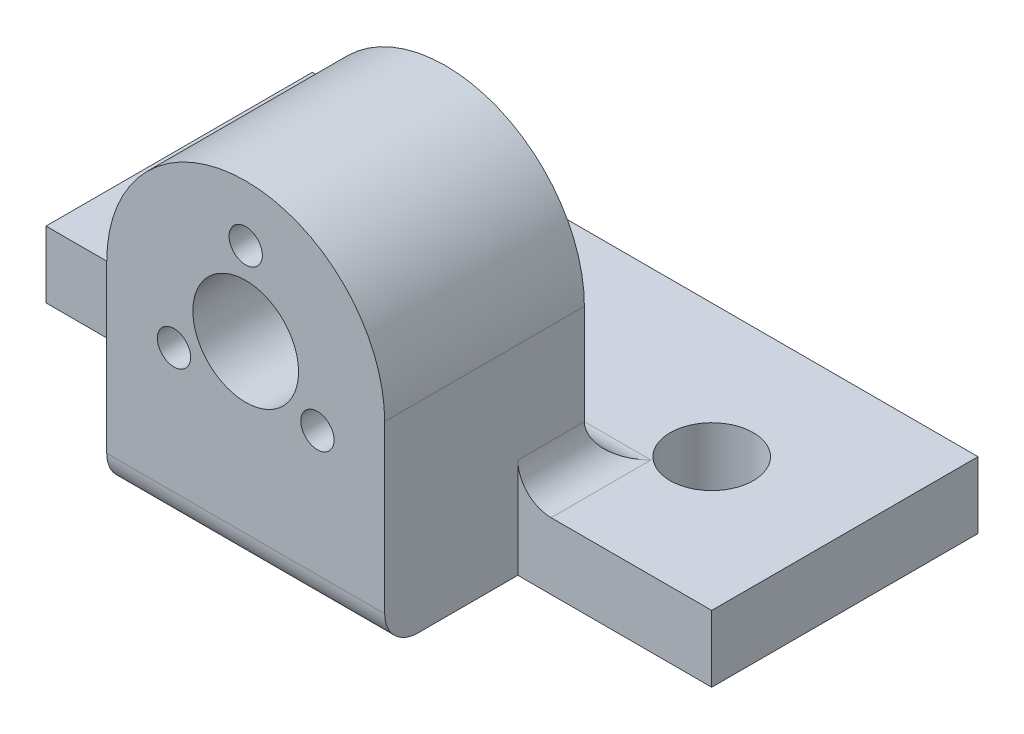
ISO-10303-21;
HEADER;
FILE_DESCRIPTION(('STEP AP214'),'2;1');
FILE_NAME('part.step','',(''),(''),'','','');
FILE_SCHEMA(('AUTOMOTIVE_DESIGN { 1 0 10303 214 1 1 1 1 }'));
ENDSEC;
DATA;
#1=APPLICATION_CONTEXT('core data for automotive mechanical design processes');
#2=APPLICATION_PROTOCOL_DEFINITION('international standard','automotive_design',2000,#1);
#3=PRODUCT_CONTEXT('',#1,'mechanical');
#4=PRODUCT('Part','Part','',(#3));
#5=PRODUCT_RELATED_PRODUCT_CATEGORY('part','',(#4));
#6=PRODUCT_DEFINITION_FORMATION('','',#4);
#7=PRODUCT_DEFINITION_CONTEXT('part definition',#1,'design');
#8=PRODUCT_DEFINITION('design','',#6,#7);
#9=PRODUCT_DEFINITION_SHAPE('','',#8);
#10=(LENGTH_UNIT() NAMED_UNIT(*) SI_UNIT(.MILLI.,.METRE.));
#11=(NAMED_UNIT(*) PLANE_ANGLE_UNIT() SI_UNIT($,.RADIAN.));
#12=(NAMED_UNIT(*) SI_UNIT($,.STERADIAN.) SOLID_ANGLE_UNIT());
#13=UNCERTAINTY_MEASURE_WITH_UNIT(LENGTH_MEASURE(1.E-05),#10,'distance_accuracy_value','');
#14=(GEOMETRIC_REPRESENTATION_CONTEXT(3) GLOBAL_UNCERTAINTY_ASSIGNED_CONTEXT((#13)) GLOBAL_UNIT_ASSIGNED_CONTEXT((#10,
#11,#12)) REPRESENTATION_CONTEXT('',''));
#15=CARTESIAN_POINT('',(0.,0.,0.));
#16=DIRECTION('',(0.,0.,1.));
#17=DIRECTION('',(1.,0.,0.));
#18=AXIS2_PLACEMENT_3D('',#15,#16,#17);
#19=CARTESIAN_POINT('',(10.,6.,4.));
#20=DIRECTION('',(0.,0.,-1.));
#21=DIRECTION('',(-1.,0.,0.));
#22=AXIS2_PLACEMENT_3D('',#19,#20,#21);
#23=CYLINDRICAL_SURFACE('',#22,1.);
#24=CARTESIAN_POINT('',(10.,6.,-2.));
#25=DIRECTION('',(0.,0.,1.));
#26=DIRECTION('',(1.,0.,0.));
#27=AXIS2_PLACEMENT_3D('',#24,#25,#26);
#28=CIRCLE('',#27,1.);
#29=CARTESIAN_POINT('',(11.,6.,-2.));
#30=VERTEX_POINT('',#29);
#31=EDGE_CURVE('E273',#30,#30,#28,.T.);
#32=ORIENTED_EDGE('',*,*,#31,.F.);
#33=EDGE_LOOP('',(#32));
#34=FACE_BOUND('',#33,.T.);
#35=CARTESIAN_POINT('',(10.,6.,0.));
#36=DIRECTION('',(0.,0.,1.));
#37=DIRECTION('',(1.,0.,0.));
#38=AXIS2_PLACEMENT_3D('',#35,#36,#37);
#39=CIRCLE('',#38,1.);
#40=CARTESIAN_POINT('',(11.,6.,0.));
#41=VERTEX_POINT('',#40);
#42=EDGE_CURVE('E229',#41,#41,#39,.T.);
#43=ORIENTED_EDGE('',*,*,#42,.T.);
#44=EDGE_LOOP('',(#43));
#45=FACE_BOUND('',#44,.T.);
#46=ADVANCED_FACE('F33',(#34,#45),#23,.F.);
#47=CARTESIAN_POINT('',(0.,2.,0.));
#48=DIRECTION('',(0.,-1.,0.));
#49=DIRECTION('',(0.,0.,-1.));
#50=AXIS2_PLACEMENT_3D('',#47,#48,#49);
#51=PLANE('',#50);
#52=CARTESIAN_POINT('',(16.,2.,-4.));
#53=DIRECTION('',(0.,1.,0.));
#54=DIRECTION('',(0.,0.,1.));
#55=AXIS2_PLACEMENT_3D('',#52,#53,#54);
#56=CIRCLE('',#55,1.25);
#57=CARTESIAN_POINT('',(16.,2.,-2.75));
#58=VERTEX_POINT('',#57);
#59=EDGE_CURVE('E181',#58,#58,#56,.T.);
#60=ORIENTED_EDGE('',*,*,#59,.F.);
#61=EDGE_LOOP('',(#60));
#62=FACE_BOUND('',#61,.T.);
#63=CARTESIAN_POINT('',(4.,2.,-4.));
#64=DIRECTION('',(0.,1.,0.));
#65=DIRECTION('',(0.,0.,1.));
#66=AXIS2_PLACEMENT_3D('',#63,#64,#65);
#67=CIRCLE('',#66,1.25);
#68=CARTESIAN_POINT('',(4.,2.,-2.75));
#69=VERTEX_POINT('',#68);
#70=EDGE_CURVE('E187',#69,#69,#67,.T.);
#71=ORIENTED_EDGE('',*,*,#70,.F.);
#72=EDGE_LOOP('',(#71));
#73=FACE_BOUND('',#72,.T.);
#74=DIRECTION('',(-1.,0.,0.));
#75=VECTOR('',#74,1.);
#76=CARTESIAN_POINT('',(14.175,2.,-3.));
#77=LINE('',#76,#75);
#78=CARTESIAN_POINT('',(4.825,2.,-3.));
#79=VERTEX_POINT('',#78);
#80=CARTESIAN_POINT('',(15.175,2.,-3.));
#81=VERTEX_POINT('',#80);
#82=EDGE_CURVE('E237',#79,#81,#77,.F.);
#83=ORIENTED_EDGE('',*,*,#82,.T.);
#84=DIRECTION('',(0.,0.,-1.));
#85=VECTOR('',#84,1.);
#86=CARTESIAN_POINT('',(15.175,2.,0.));
#87=LINE('',#86,#85);
#88=CARTESIAN_POINT('',(15.175,2.,0.));
#89=VERTEX_POINT('',#88);
#90=EDGE_CURVE('E239',#81,#89,#87,.F.);
#91=ORIENTED_EDGE('',*,*,#90,.T.);
#92=DIRECTION('',(1.,0.,0.));
#93=VECTOR('',#92,1.);
#94=CARTESIAN_POINT('',(0.,2.,0.));
#95=LINE('',#94,#93);
#96=CARTESIAN_POINT('',(20.,2.,0.));
#97=VERTEX_POINT('',#96);
#98=EDGE_CURVE('E196',#89,#97,#95,.T.);
#99=ORIENTED_EDGE('',*,*,#98,.T.);
#100=DIRECTION('',(0.,0.,-1.));
#101=VECTOR('',#100,1.);
#102=CARTESIAN_POINT('',(20.,2.,0.));
#103=LINE('',#102,#101);
#104=CARTESIAN_POINT('',(20.,2.,-8.));
#105=VERTEX_POINT('',#104);
#106=EDGE_CURVE('E201',#97,#105,#103,.T.);
#107=ORIENTED_EDGE('',*,*,#106,.T.);
#108=DIRECTION('',(-1.,0.,0.));
#109=VECTOR('',#108,1.);
#110=CARTESIAN_POINT('',(0.,2.,-8.));
#111=LINE('',#110,#109);
#112=CARTESIAN_POINT('',(0.,2.,-8.));
#113=VERTEX_POINT('',#112);
#114=EDGE_CURVE('E203',#105,#113,#111,.T.);
#115=ORIENTED_EDGE('',*,*,#114,.T.);
#116=DIRECTION('',(0.,0.,1.));
#117=VECTOR('',#116,1.);
#118=CARTESIAN_POINT('',(0.,2.,0.));
#119=LINE('',#118,#117);
#120=CARTESIAN_POINT('',(0.,2.,0.));
#121=VERTEX_POINT('',#120);
#122=EDGE_CURVE('E193',#113,#121,#119,.T.);
#123=ORIENTED_EDGE('',*,*,#122,.T.);
#124=CARTESIAN_POINT('',(4.825,2.,0.));
#125=VERTEX_POINT('',#124);
#126=EDGE_CURVE('E198',#121,#125,#95,.T.);
#127=ORIENTED_EDGE('',*,*,#126,.T.);
#128=DIRECTION('',(0.,0.,1.));
#129=VECTOR('',#128,1.);
#130=CARTESIAN_POINT('',(4.825,2.,-2.));
#131=LINE('',#130,#129);
#132=EDGE_CURVE('E235',#125,#79,#131,.F.);
#133=ORIENTED_EDGE('',*,*,#132,.T.);
#134=EDGE_LOOP('',(#83,#91,#99,#107,#115,#123,#127,#133));
#135=FACE_BOUND('',#134,.T.);
#136=ADVANCED_FACE('F300',(#62,#73,#135),#51,.F.);
#137=CARTESIAN_POINT('',(0.,2.,0.));
#138=DIRECTION('',(0.,0.,-1.));
#139=DIRECTION('',(-1.,0.,0.));
#140=AXIS2_PLACEMENT_3D('',#137,#138,#139);
#141=PLANE('',#140);
#142=DIRECTION('',(0.,1.,0.));
#143=VECTOR('',#142,1.);
#144=CARTESIAN_POINT('',(14.175,2.,0.));
#145=LINE('',#144,#143);
#146=CARTESIAN_POINT('',(14.175,0.,0.));
#147=VERTEX_POINT('',#146);
#148=CARTESIAN_POINT('',(14.175,3.,0.));
#149=VERTEX_POINT('',#148);
#150=EDGE_CURVE('E226',#147,#149,#145,.T.);
#151=ORIENTED_EDGE('',*,*,#150,.F.);
#152=DIRECTION('',(1.,0.,0.));
#153=VECTOR('',#152,1.);
#154=CARTESIAN_POINT('',(0.,0.,0.));
#155=LINE('',#154,#153);
#156=CARTESIAN_POINT('',(20.,0.,0.));
#157=VERTEX_POINT('',#156);
#158=EDGE_CURVE('E208',#147,#157,#155,.T.);
#159=ORIENTED_EDGE('',*,*,#158,.T.);
#160=DIRECTION('',(0.,-1.,0.));
#161=VECTOR('',#160,1.);
#162=CARTESIAN_POINT('',(20.,2.,0.));
#163=LINE('',#162,#161);
#164=EDGE_CURVE('E219',#97,#157,#163,.T.);
#165=ORIENTED_EDGE('',*,*,#164,.F.);
#166=ORIENTED_EDGE('',*,*,#98,.F.);
#167=CARTESIAN_POINT('',(15.175,3.,0.));
#168=DIRECTION('',(0.,0.,-1.));
#169=DIRECTION('',(-1.,0.,0.));
#170=AXIS2_PLACEMENT_3D('',#167,#168,#169);
#171=CIRCLE('',#170,1.);
#172=EDGE_CURVE('E42',#89,#149,#171,.T.);
#173=ORIENTED_EDGE('',*,*,#172,.T.);
#174=EDGE_LOOP('',(#151,#159,#165,#166,#173));
#175=FACE_BOUND('',#174,.T.);
#176=ADVANCED_FACE('F308',(#175),#141,.F.);
#177=DIRECTION('',(0.,-1.,0.));
#178=VECTOR('',#177,1.);
#179=CARTESIAN_POINT('',(5.825,2.,0.));
#180=LINE('',#179,#178);
#181=CARTESIAN_POINT('',(5.825,3.,0.));
#182=VERTEX_POINT('',#181);
#183=CARTESIAN_POINT('',(5.825,0.,0.));
#184=VERTEX_POINT('',#183);
#185=EDGE_CURVE('E49',#182,#184,#180,.T.);
#186=ORIENTED_EDGE('',*,*,#185,.F.);
#187=CARTESIAN_POINT('',(4.825,3.,0.));
#188=DIRECTION('',(0.,0.,-1.));
#189=DIRECTION('',(-1.,0.,0.));
#190=AXIS2_PLACEMENT_3D('',#187,#188,#189);
#191=CIRCLE('',#190,1.);
#192=EDGE_CURVE('E11',#182,#125,#191,.T.);
#193=ORIENTED_EDGE('',*,*,#192,.T.);
#194=ORIENTED_EDGE('',*,*,#126,.F.);
#195=DIRECTION('',(0.,-1.,0.));
#196=VECTOR('',#195,1.);
#197=CARTESIAN_POINT('',(0.,2.,0.));
#198=LINE('',#197,#196);
#199=CARTESIAN_POINT('',(0.,0.,0.));
#200=VERTEX_POINT('',#199);
#201=EDGE_CURVE('E222',#121,#200,#198,.T.);
#202=ORIENTED_EDGE('',*,*,#201,.T.);
#203=EDGE_CURVE('E209',#200,#184,#155,.T.);
#204=ORIENTED_EDGE('',*,*,#203,.T.);
#205=EDGE_LOOP('',(#186,#193,#194,#202,#204));
#206=FACE_BOUND('',#205,.T.);
#207=ADVANCED_FACE('F342',(#206),#141,.F.);
#208=CARTESIAN_POINT('',(0.,0.,0.));
#209=DIRECTION('',(0.,-1.,0.));
#210=DIRECTION('',(0.,0.,-1.));
#211=AXIS2_PLACEMENT_3D('',#208,#209,#210);
#212=PLANE('',#211);
#213=DIRECTION('',(0.,0.,-1.));
#214=VECTOR('',#213,1.);
#215=CARTESIAN_POINT('',(14.175,0.,4.));
#216=LINE('',#215,#214);
#217=CARTESIAN_POINT('',(14.175,0.,3.));
#218=VERTEX_POINT('',#217);
#219=EDGE_CURVE('E152',#218,#147,#216,.T.);
#220=ORIENTED_EDGE('',*,*,#219,.F.);
#221=DIRECTION('',(1.,0.,0.));
#222=VECTOR('',#221,1.);
#223=CARTESIAN_POINT('',(0.,0.,3.));
#224=LINE('',#223,#222);
#225=CARTESIAN_POINT('',(5.825,0.,3.));
#226=VERTEX_POINT('',#225);
#227=EDGE_CURVE('E57',#218,#226,#224,.F.);
#228=ORIENTED_EDGE('',*,*,#227,.T.);
#229=DIRECTION('',(0.,0.,-1.));
#230=VECTOR('',#229,1.);
#231=CARTESIAN_POINT('',(5.825,0.,4.));
#232=LINE('',#231,#230);
#233=EDGE_CURVE('E178',#226,#184,#232,.T.);
#234=ORIENTED_EDGE('',*,*,#233,.T.);
#235=ORIENTED_EDGE('',*,*,#203,.F.);
#236=DIRECTION('',(0.,0.,1.));
#237=VECTOR('',#236,1.);
#238=CARTESIAN_POINT('',(0.,0.,0.));
#239=LINE('',#238,#237);
#240=CARTESIAN_POINT('',(0.,0.,-8.));
#241=VERTEX_POINT('',#240);
#242=EDGE_CURVE('E190',#241,#200,#239,.T.);
#243=ORIENTED_EDGE('',*,*,#242,.F.);
#244=DIRECTION('',(-1.,0.,0.));
#245=VECTOR('',#244,1.);
#246=CARTESIAN_POINT('',(0.,0.,-8.));
#247=LINE('',#246,#245);
#248=CARTESIAN_POINT('',(20.,0.,-8.));
#249=VERTEX_POINT('',#248);
#250=EDGE_CURVE('E197',#249,#241,#247,.T.);
#251=ORIENTED_EDGE('',*,*,#250,.F.);
#252=DIRECTION('',(0.,0.,-1.));
#253=VECTOR('',#252,1.);
#254=CARTESIAN_POINT('',(20.,0.,0.));
#255=LINE('',#254,#253);
#256=EDGE_CURVE('E211',#157,#249,#255,.T.);
#257=ORIENTED_EDGE('',*,*,#256,.F.);
#258=ORIENTED_EDGE('',*,*,#158,.F.);
#259=EDGE_LOOP('',(#220,#228,#234,#235,#243,#251,#257,#258));
#260=FACE_BOUND('',#259,.T.);
#261=CARTESIAN_POINT('',(16.,0.,-4.));
#262=DIRECTION('',(0.,1.,0.));
#263=DIRECTION('',(0.,0.,1.));
#264=AXIS2_PLACEMENT_3D('',#261,#262,#263);
#265=CIRCLE('',#264,1.25);
#266=CARTESIAN_POINT('',(16.,0.,-2.75));
#267=VERTEX_POINT('',#266);
#268=EDGE_CURVE('E180',#267,#267,#265,.T.);
#269=ORIENTED_EDGE('',*,*,#268,.T.);
#270=EDGE_LOOP('',(#269));
#271=FACE_BOUND('',#270,.T.);
#272=CARTESIAN_POINT('',(4.,0.,-4.));
#273=DIRECTION('',(0.,1.,0.));
#274=DIRECTION('',(0.,0.,1.));
#275=AXIS2_PLACEMENT_3D('',#272,#273,#274);
#276=CIRCLE('',#275,1.25);
#277=CARTESIAN_POINT('',(4.,0.,-2.75));
#278=VERTEX_POINT('',#277);
#279=EDGE_CURVE('E184',#278,#278,#276,.T.);
#280=ORIENTED_EDGE('',*,*,#279,.T.);
#281=EDGE_LOOP('',(#280));
#282=FACE_BOUND('',#281,.T.);
#283=ADVANCED_FACE('F289',(#260,#271,#282),#212,.T.);
#284=CARTESIAN_POINT('',(0.,2.,0.));
#285=DIRECTION('',(1.,0.,0.));
#286=DIRECTION('',(0.,0.,-1.));
#287=AXIS2_PLACEMENT_3D('',#284,#285,#286);
#288=PLANE('',#287);
#289=ORIENTED_EDGE('',*,*,#242,.T.);
#290=ORIENTED_EDGE('',*,*,#201,.F.);
#291=ORIENTED_EDGE('',*,*,#122,.F.);
#292=DIRECTION('',(0.,-1.,0.));
#293=VECTOR('',#292,1.);
#294=CARTESIAN_POINT('',(0.,2.,-8.));
#295=LINE('',#294,#293);
#296=EDGE_CURVE('E205',#113,#241,#295,.T.);
#297=ORIENTED_EDGE('',*,*,#296,.T.);
#298=EDGE_LOOP('',(#289,#290,#291,#297));
#299=FACE_BOUND('',#298,.T.);
#300=ADVANCED_FACE('F341',(#299),#288,.F.);
#301=CARTESIAN_POINT('',(20.,2.,0.));
#302=DIRECTION('',(-1.,0.,0.));
#303=DIRECTION('',(0.,0.,1.));
#304=AXIS2_PLACEMENT_3D('',#301,#302,#303);
#305=PLANE('',#304);
#306=ORIENTED_EDGE('',*,*,#256,.T.);
#307=DIRECTION('',(0.,-1.,0.));
#308=VECTOR('',#307,1.);
#309=CARTESIAN_POINT('',(20.,2.,-8.));
#310=LINE('',#309,#308);
#311=EDGE_CURVE('E216',#105,#249,#310,.T.);
#312=ORIENTED_EDGE('',*,*,#311,.F.);
#313=ORIENTED_EDGE('',*,*,#106,.F.);
#314=ORIENTED_EDGE('',*,*,#164,.T.);
#315=EDGE_LOOP('',(#306,#312,#313,#314));
#316=FACE_BOUND('',#315,.T.);
#317=ADVANCED_FACE('F345',(#316),#305,.F.);
#318=CARTESIAN_POINT('',(0.,2.,-8.));
#319=DIRECTION('',(0.,0.,1.));
#320=DIRECTION('',(1.,0.,0.));
#321=AXIS2_PLACEMENT_3D('',#318,#319,#320);
#322=PLANE('',#321);
#323=ORIENTED_EDGE('',*,*,#250,.T.);
#324=ORIENTED_EDGE('',*,*,#296,.F.);
#325=ORIENTED_EDGE('',*,*,#114,.F.);
#326=ORIENTED_EDGE('',*,*,#311,.T.);
#327=EDGE_LOOP('',(#323,#324,#325,#326));
#328=FACE_BOUND('',#327,.T.);
#329=ADVANCED_FACE('F336',(#328),#322,.F.);
#330=CARTESIAN_POINT('',(4.,2.,-4.));
#331=DIRECTION('',(0.,-1.,0.));
#332=DIRECTION('',(0.,0.,-1.));
#333=AXIS2_PLACEMENT_3D('',#330,#331,#332);
#334=CYLINDRICAL_SURFACE('',#333,1.25);
#335=ORIENTED_EDGE('',*,*,#70,.T.);
#336=EDGE_LOOP('',(#335));
#337=FACE_BOUND('',#336,.T.);
#338=ORIENTED_EDGE('',*,*,#279,.F.);
#339=EDGE_LOOP('',(#338));
#340=FACE_BOUND('',#339,.T.);
#341=ADVANCED_FACE('F333',(#337,#340),#334,.F.);
#342=CARTESIAN_POINT('',(16.,2.,-4.));
#343=DIRECTION('',(0.,-1.,0.));
#344=DIRECTION('',(0.,0.,-1.));
#345=AXIS2_PLACEMENT_3D('',#342,#343,#344);
#346=CYLINDRICAL_SURFACE('',#345,1.25);
#347=ORIENTED_EDGE('',*,*,#59,.T.);
#348=EDGE_LOOP('',(#347));
#349=FACE_BOUND('',#348,.T.);
#350=ORIENTED_EDGE('',*,*,#268,.F.);
#351=EDGE_LOOP('',(#350));
#352=FACE_BOUND('',#351,.T.);
#353=ADVANCED_FACE('F330',(#349,#352),#346,.F.);
#354=CARTESIAN_POINT('',(10.,6.,-2.));
#355=DIRECTION('',(0.,0.,1.));
#356=DIRECTION('',(1.,0.,0.));
#357=AXIS2_PLACEMENT_3D('',#354,#355,#356);
#358=PLANE('',#357);
#359=CARTESIAN_POINT('',(10.,8.4875,-2.));
#360=DIRECTION('',(0.,0.,1.));
#361=DIRECTION('',(1.,0.,0.));
#362=AXIS2_PLACEMENT_3D('',#359,#360,#361);
#363=CIRCLE('',#362,0.500000000000001);
#364=CARTESIAN_POINT('',(10.5,8.4875,-2.));
#365=VERTEX_POINT('',#364);
#366=EDGE_CURVE('E276',#365,#365,#363,.T.);
#367=ORIENTED_EDGE('',*,*,#366,.T.);
#368=EDGE_LOOP('',(#367));
#369=FACE_BOUND('',#368,.T.);
#370=ORIENTED_EDGE('',*,*,#31,.T.);
#371=EDGE_LOOP('',(#370));
#372=FACE_BOUND('',#371,.T.);
#373=CARTESIAN_POINT('',(12.1542381919138,4.75625,-2.));
#374=DIRECTION('',(0.,0.,1.));
#375=DIRECTION('',(1.,0.,0.));
#376=AXIS2_PLACEMENT_3D('',#373,#374,#375);
#377=CIRCLE('',#376,0.500000000000001);
#378=CARTESIAN_POINT('',(12.6542381919138,4.75625,-2.));
#379=VERTEX_POINT('',#378);
#380=EDGE_CURVE('E270',#379,#379,#377,.T.);
#381=ORIENTED_EDGE('',*,*,#380,.T.);
#382=EDGE_LOOP('',(#381));
#383=FACE_BOUND('',#382,.T.);
#384=CARTESIAN_POINT('',(7.84576180808621,4.75625,-2.));
#385=DIRECTION('',(0.,0.,1.));
#386=DIRECTION('',(1.,0.,0.));
#387=AXIS2_PLACEMENT_3D('',#384,#385,#386);
#388=CIRCLE('',#387,0.500000000000003);
#389=CARTESIAN_POINT('',(8.34576180808621,4.75625,-2.));
#390=VERTEX_POINT('',#389);
#391=EDGE_CURVE('E232',#390,#390,#388,.T.);
#392=ORIENTED_EDGE('',*,*,#391,.T.);
#393=EDGE_LOOP('',(#392));
#394=FACE_BOUND('',#393,.T.);
#395=DIRECTION('',(0.,1.,0.));
#396=VECTOR('',#395,1.);
#397=CARTESIAN_POINT('',(14.175,2.,-2.));
#398=LINE('',#397,#396);
#399=CARTESIAN_POINT('',(14.175,3.,-2.));
#400=VERTEX_POINT('',#399);
#401=CARTESIAN_POINT('',(14.175,6.,-2.));
#402=VERTEX_POINT('',#401);
#403=EDGE_CURVE('E131',#400,#402,#398,.T.);
#404=ORIENTED_EDGE('',*,*,#403,.F.);
#405=DIRECTION('',(-1.,0.,0.));
#406=VECTOR('',#405,1.);
#407=CARTESIAN_POINT('',(5.825,3.,-2.));
#408=LINE('',#407,#406);
#409=CARTESIAN_POINT('',(5.825,3.,-2.));
#410=VERTEX_POINT('',#409);
#411=EDGE_CURVE('E228',#400,#410,#408,.T.);
#412=ORIENTED_EDGE('',*,*,#411,.T.);
#413=DIRECTION('',(0.,-1.,0.));
#414=VECTOR('',#413,1.);
#415=CARTESIAN_POINT('',(5.825,2.,-2.));
#416=LINE('',#415,#414);
#417=CARTESIAN_POINT('',(5.825,6.,-2.));
#418=VERTEX_POINT('',#417);
#419=EDGE_CURVE('E144',#418,#410,#416,.T.);
#420=ORIENTED_EDGE('',*,*,#419,.F.);
#421=CARTESIAN_POINT('',(10.,6.,-2.));
#422=DIRECTION('',(0.,0.,1.));
#423=DIRECTION('',(1.,0.,0.));
#424=AXIS2_PLACEMENT_3D('',#421,#422,#423);
#425=CIRCLE('',#424,4.175);
#426=EDGE_CURVE('E143',#402,#418,#425,.T.);
#427=ORIENTED_EDGE('',*,*,#426,.F.);
#428=EDGE_LOOP('',(#404,#412,#420,#427));
#429=FACE_BOUND('',#428,.T.);
#430=ADVANCED_FACE('F156',(#369,#372,#383,#394,#429),#358,.F.);
#431=CARTESIAN_POINT('',(14.175,2.,4.));
#432=DIRECTION('',(-1.,0.,0.));
#433=DIRECTION('',(0.,0.,1.));
#434=AXIS2_PLACEMENT_3D('',#431,#432,#433);
#435=PLANE('',#434);
#436=ORIENTED_EDGE('',*,*,#150,.T.);
#437=DIRECTION('',(0.,0.,-1.));
#438=VECTOR('',#437,1.);
#439=CARTESIAN_POINT('',(14.175,3.,-2.));
#440=LINE('',#439,#438);
#441=EDGE_CURVE('E138',#149,#400,#440,.T.);
#442=ORIENTED_EDGE('',*,*,#441,.T.);
#443=ORIENTED_EDGE('',*,*,#403,.T.);
#444=DIRECTION('',(0.,0.,-1.));
#445=VECTOR('',#444,1.);
#446=CARTESIAN_POINT('',(14.175,6.,4.));
#447=LINE('',#446,#445);
#448=CARTESIAN_POINT('',(14.175,6.,4.));
#449=VERTEX_POINT('',#448);
#450=EDGE_CURVE('E135',#449,#402,#447,.T.);
#451=ORIENTED_EDGE('',*,*,#450,.F.);
#452=DIRECTION('',(0.,1.,0.));
#453=VECTOR('',#452,1.);
#454=CARTESIAN_POINT('',(14.175,2.,4.));
#455=LINE('',#454,#453);
#456=CARTESIAN_POINT('',(14.175,1.,4.));
#457=VERTEX_POINT('',#456);
#458=EDGE_CURVE('E173',#457,#449,#455,.T.);
#459=ORIENTED_EDGE('',*,*,#458,.F.);
#460=CARTESIAN_POINT('',(14.175,1.,3.));
#461=DIRECTION('',(-1.,0.,0.));
#462=DIRECTION('',(0.,0.,1.));
#463=AXIS2_PLACEMENT_3D('',#460,#461,#462);
#464=CIRCLE('',#463,1.);
#465=EDGE_CURVE('E241',#457,#218,#464,.F.);
#466=ORIENTED_EDGE('',*,*,#465,.T.);
#467=ORIENTED_EDGE('',*,*,#219,.T.);
#468=EDGE_LOOP('',(#436,#442,#443,#451,#459,#466,#467));
#469=FACE_BOUND('',#468,.T.);
#470=ADVANCED_FACE('F133',(#469),#435,.F.);
#471=CARTESIAN_POINT('',(5.825,2.,4.));
#472=DIRECTION('',(1.,0.,0.));
#473=DIRECTION('',(0.,0.,-1.));
#474=AXIS2_PLACEMENT_3D('',#471,#472,#473);
#475=PLANE('',#474);
#476=ORIENTED_EDGE('',*,*,#233,.F.);
#477=CARTESIAN_POINT('',(5.825,1.,3.));
#478=DIRECTION('',(1.,0.,0.));
#479=DIRECTION('',(0.,0.,-1.));
#480=AXIS2_PLACEMENT_3D('',#477,#478,#479);
#481=CIRCLE('',#480,1.);
#482=CARTESIAN_POINT('',(5.825,1.,4.));
#483=VERTEX_POINT('',#482);
#484=EDGE_CURVE('E250',#226,#483,#481,.F.);
#485=ORIENTED_EDGE('',*,*,#484,.T.);
#486=DIRECTION('',(0.,-1.,0.));
#487=VECTOR('',#486,1.);
#488=CARTESIAN_POINT('',(5.825,2.,4.));
#489=LINE('',#488,#487);
#490=CARTESIAN_POINT('',(5.825,6.,4.));
#491=VERTEX_POINT('',#490);
#492=EDGE_CURVE('E170',#491,#483,#489,.T.);
#493=ORIENTED_EDGE('',*,*,#492,.F.);
#494=DIRECTION('',(0.,0.,-1.));
#495=VECTOR('',#494,1.);
#496=CARTESIAN_POINT('',(5.825,6.,4.));
#497=LINE('',#496,#495);
#498=EDGE_CURVE('E153',#491,#418,#497,.T.);
#499=ORIENTED_EDGE('',*,*,#498,.T.);
#500=ORIENTED_EDGE('',*,*,#419,.T.);
#501=DIRECTION('',(0.,0.,1.));
#502=VECTOR('',#501,1.);
#503=CARTESIAN_POINT('',(5.825,3.,0.));
#504=LINE('',#503,#502);
#505=EDGE_CURVE('E248',#410,#182,#504,.T.);
#506=ORIENTED_EDGE('',*,*,#505,.T.);
#507=ORIENTED_EDGE('',*,*,#185,.T.);
#508=EDGE_LOOP('',(#476,#485,#493,#499,#500,#506,#507));
#509=FACE_BOUND('',#508,.T.);
#510=ADVANCED_FACE('F279',(#509),#475,.F.);
#511=CARTESIAN_POINT('',(10.,6.,4.));
#512=DIRECTION('',(0.,0.,1.));
#513=DIRECTION('',(1.,0.,0.));
#514=AXIS2_PLACEMENT_3D('',#511,#512,#513);
#515=PLANE('',#514);
#516=CARTESIAN_POINT('',(10.,6.,4.));
#517=DIRECTION('',(0.,0.,1.));
#518=DIRECTION('',(1.,0.,0.));
#519=AXIS2_PLACEMENT_3D('',#516,#517,#518);
#520=CIRCLE('',#519,1.5875);
#521=CARTESIAN_POINT('',(11.5875,6.,4.));
#522=VERTEX_POINT('',#521);
#523=EDGE_CURVE('E260',#522,#522,#520,.T.);
#524=ORIENTED_EDGE('',*,*,#523,.F.);
#525=EDGE_LOOP('',(#524));
#526=FACE_BOUND('',#525,.T.);
#527=CARTESIAN_POINT('',(12.1542381919138,4.75625,4.));
#528=DIRECTION('',(0.,0.,1.));
#529=DIRECTION('',(1.,0.,0.));
#530=AXIS2_PLACEMENT_3D('',#527,#528,#529);
#531=CIRCLE('',#530,0.500000000000001);
#532=CARTESIAN_POINT('',(12.6542381919138,4.75625,4.));
#533=VERTEX_POINT('',#532);
#534=EDGE_CURVE('E161',#533,#533,#531,.T.);
#535=ORIENTED_EDGE('',*,*,#534,.F.);
#536=EDGE_LOOP('',(#535));
#537=FACE_BOUND('',#536,.T.);
#538=CARTESIAN_POINT('',(10.,8.4875,4.));
#539=DIRECTION('',(0.,0.,1.));
#540=DIRECTION('',(1.,0.,0.));
#541=AXIS2_PLACEMENT_3D('',#538,#539,#540);
#542=CIRCLE('',#541,0.500000000000001);
#543=CARTESIAN_POINT('',(10.5,8.4875,4.));
#544=VERTEX_POINT('',#543);
#545=EDGE_CURVE('E167',#544,#544,#542,.T.);
#546=ORIENTED_EDGE('',*,*,#545,.F.);
#547=EDGE_LOOP('',(#546));
#548=FACE_BOUND('',#547,.T.);
#549=ORIENTED_EDGE('',*,*,#492,.T.);
#550=DIRECTION('',(1.,0.,0.));
#551=VECTOR('',#550,1.);
#552=CARTESIAN_POINT('',(10.,1.,4.));
#553=LINE('',#552,#551);
#554=EDGE_CURVE('E244',#483,#457,#553,.T.);
#555=ORIENTED_EDGE('',*,*,#554,.T.);
#556=ORIENTED_EDGE('',*,*,#458,.T.);
#557=CARTESIAN_POINT('',(10.,6.,4.));
#558=DIRECTION('',(0.,0.,1.));
#559=DIRECTION('',(1.,0.,0.));
#560=AXIS2_PLACEMENT_3D('',#557,#558,#559);
#561=CIRCLE('',#560,4.175);
#562=EDGE_CURVE('E151',#449,#491,#561,.T.);
#563=ORIENTED_EDGE('',*,*,#562,.T.);
#564=EDGE_LOOP('',(#549,#555,#556,#563));
#565=FACE_BOUND('',#564,.T.);
#566=CARTESIAN_POINT('',(7.84576180808621,4.75625,4.));
#567=DIRECTION('',(0.,0.,1.));
#568=DIRECTION('',(1.,0.,0.));
#569=AXIS2_PLACEMENT_3D('',#566,#567,#568);
#570=CIRCLE('',#569,0.500000000000003);
#571=CARTESIAN_POINT('',(8.34576180808621,4.75625,4.));
#572=VERTEX_POINT('',#571);
#573=EDGE_CURVE('E158',#572,#572,#570,.T.);
#574=ORIENTED_EDGE('',*,*,#573,.F.);
#575=EDGE_LOOP('',(#574));
#576=FACE_BOUND('',#575,.T.);
#577=ADVANCED_FACE('F284',(#526,#537,#548,#565,#576),#515,.T.);
#578=CARTESIAN_POINT('',(10.,6.,4.));
#579=DIRECTION('',(0.,0.,-1.));
#580=DIRECTION('',(-1.,0.,0.));
#581=AXIS2_PLACEMENT_3D('',#578,#579,#580);
#582=CYLINDRICAL_SURFACE('',#581,4.175);
#583=ORIENTED_EDGE('',*,*,#450,.T.);
#584=ORIENTED_EDGE('',*,*,#426,.T.);
#585=ORIENTED_EDGE('',*,*,#498,.F.);
#586=ORIENTED_EDGE('',*,*,#562,.F.);
#587=EDGE_LOOP('',(#583,#584,#585,#586));
#588=FACE_BOUND('',#587,.T.);
#589=ADVANCED_FACE('F148',(#588),#582,.T.);
#590=CARTESIAN_POINT('',(10.,8.4875,4.));
#591=DIRECTION('',(0.,0.,-1.));
#592=DIRECTION('',(-1.,0.,0.));
#593=AXIS2_PLACEMENT_3D('',#590,#591,#592);
#594=CYLINDRICAL_SURFACE('',#593,0.500000000000001);
#595=ORIENTED_EDGE('',*,*,#545,.T.);
#596=EDGE_LOOP('',(#595));
#597=FACE_BOUND('',#596,.T.);
#598=ORIENTED_EDGE('',*,*,#366,.F.);
#599=EDGE_LOOP('',(#598));
#600=FACE_BOUND('',#599,.T.);
#601=ADVANCED_FACE('F317',(#597,#600),#594,.F.);
#602=CARTESIAN_POINT('',(12.1542381919138,4.75625,4.));
#603=DIRECTION('',(0.,0.,-1.));
#604=DIRECTION('',(-1.,0.,0.));
#605=AXIS2_PLACEMENT_3D('',#602,#603,#604);
#606=CYLINDRICAL_SURFACE('',#605,0.500000000000001);
#607=ORIENTED_EDGE('',*,*,#534,.T.);
#608=EDGE_LOOP('',(#607));
#609=FACE_BOUND('',#608,.T.);
#610=ORIENTED_EDGE('',*,*,#380,.F.);
#611=EDGE_LOOP('',(#610));
#612=FACE_BOUND('',#611,.T.);
#613=ADVANCED_FACE('F315',(#609,#612),#606,.F.);
#614=CARTESIAN_POINT('',(7.84576180808621,4.75625,4.));
#615=DIRECTION('',(0.,0.,-1.));
#616=DIRECTION('',(-1.,0.,0.));
#617=AXIS2_PLACEMENT_3D('',#614,#615,#616);
#618=CYLINDRICAL_SURFACE('',#617,0.500000000000003);
#619=ORIENTED_EDGE('',*,*,#573,.T.);
#620=EDGE_LOOP('',(#619));
#621=FACE_BOUND('',#620,.T.);
#622=ORIENTED_EDGE('',*,*,#391,.F.);
#623=EDGE_LOOP('',(#622));
#624=FACE_BOUND('',#623,.T.);
#625=ADVANCED_FACE('F444',(#621,#624),#618,.F.);
#626=CARTESIAN_POINT('',(10.,6.,0.));
#627=DIRECTION('',(0.,0.,1.));
#628=DIRECTION('',(1.,0.,0.));
#629=AXIS2_PLACEMENT_3D('',#626,#627,#628);
#630=CYLINDRICAL_SURFACE('',#629,1.5875);
#631=CARTESIAN_POINT('',(10.,6.,0.));
#632=DIRECTION('',(0.,0.,1.));
#633=DIRECTION('',(1.,0.,0.));
#634=AXIS2_PLACEMENT_3D('',#631,#632,#633);
#635=CIRCLE('',#634,1.5875);
#636=CARTESIAN_POINT('',(11.5875,6.,0.));
#637=VERTEX_POINT('',#636);
#638=EDGE_CURVE('E233',#637,#637,#635,.T.);
#639=ORIENTED_EDGE('',*,*,#638,.F.);
#640=EDGE_LOOP('',(#639));
#641=FACE_BOUND('',#640,.T.);
#642=ORIENTED_EDGE('',*,*,#523,.T.);
#643=EDGE_LOOP('',(#642));
#644=FACE_BOUND('',#643,.T.);
#645=ADVANCED_FACE('F365',(#641,#644),#630,.F.);
#646=CARTESIAN_POINT('',(10.,6.,0.));
#647=DIRECTION('',(0.,0.,1.));
#648=DIRECTION('',(1.,0.,0.));
#649=AXIS2_PLACEMENT_3D('',#646,#647,#648);
#650=PLANE('',#649);
#651=ORIENTED_EDGE('',*,*,#42,.F.);
#652=EDGE_LOOP('',(#651));
#653=FACE_BOUND('',#652,.T.);
#654=ORIENTED_EDGE('',*,*,#638,.T.);
#655=EDGE_LOOP('',(#654));
#656=FACE_BOUND('',#655,.T.);
#657=ADVANCED_FACE('F360',(#653,#656),#650,.T.);
#658=CARTESIAN_POINT('',(15.175,3.,4.));
#659=DIRECTION('',(0.,0.,1.));
#660=DIRECTION('',(1.,0.,0.));
#661=AXIS2_PLACEMENT_3D('',#658,#659,#660);
#662=CYLINDRICAL_SURFACE('',#661,1.);
#663=ORIENTED_EDGE('',*,*,#172,.F.);
#664=ORIENTED_EDGE('',*,*,#90,.F.);
#665=CARTESIAN_POINT('',(15.175,3.,-3.));
#666=DIRECTION('',(0.707106781186547,0.,0.707106781186547));
#667=DIRECTION('',(-0.707106781186547,0.,0.707106781186547));
#668=AXIS2_PLACEMENT_3D('',#665,#666,#667);
#669=ELLIPSE('',#668,1.41421356237309,1.);
#670=EDGE_CURVE('E37',#400,#81,#669,.T.);
#671=ORIENTED_EDGE('',*,*,#670,.F.);
#672=ORIENTED_EDGE('',*,*,#441,.F.);
#673=EDGE_LOOP('',(#663,#664,#671,#672));
#674=FACE_BOUND('',#673,.T.);
#675=ADVANCED_FACE('F357',(#674),#662,.F.);
#676=CARTESIAN_POINT('',(4.825,3.,4.));
#677=DIRECTION('',(0.,0.,-1.));
#678=DIRECTION('',(-1.,0.,0.));
#679=AXIS2_PLACEMENT_3D('',#676,#677,#678);
#680=CYLINDRICAL_SURFACE('',#679,1.);
#681=ORIENTED_EDGE('',*,*,#192,.F.);
#682=ORIENTED_EDGE('',*,*,#505,.F.);
#683=CARTESIAN_POINT('',(4.825,3.,-3.));
#684=DIRECTION('',(0.707106781186547,0.,-0.707106781186547));
#685=DIRECTION('',(-0.707106781186547,0.,-0.707106781186547));
#686=AXIS2_PLACEMENT_3D('',#683,#684,#685);
#687=ELLIPSE('',#686,1.41421356237309,1.);
#688=EDGE_CURVE('E253',#79,#410,#687,.F.);
#689=ORIENTED_EDGE('',*,*,#688,.F.);
#690=ORIENTED_EDGE('',*,*,#132,.F.);
#691=EDGE_LOOP('',(#681,#682,#689,#690));
#692=FACE_BOUND('',#691,.T.);
#693=ADVANCED_FACE('F297',(#692),#680,.F.);
#694=CARTESIAN_POINT('',(10.,3.,-3.));
#695=DIRECTION('',(1.,0.,0.));
#696=DIRECTION('',(0.,0.,-1.));
#697=AXIS2_PLACEMENT_3D('',#694,#695,#696);
#698=CYLINDRICAL_SURFACE('',#697,1.);
#699=ORIENTED_EDGE('',*,*,#670,.T.);
#700=ORIENTED_EDGE('',*,*,#82,.F.);
#701=ORIENTED_EDGE('',*,*,#688,.T.);
#702=ORIENTED_EDGE('',*,*,#411,.F.);
#703=EDGE_LOOP('',(#699,#700,#701,#702));
#704=FACE_BOUND('',#703,.T.);
#705=ADVANCED_FACE('F293',(#704),#698,.F.);
#706=CARTESIAN_POINT('',(10.,1.,3.));
#707=DIRECTION('',(1.,0.,0.));
#708=DIRECTION('',(0.,0.,-1.));
#709=AXIS2_PLACEMENT_3D('',#706,#707,#708);
#710=CYLINDRICAL_SURFACE('',#709,1.);
#711=ORIENTED_EDGE('',*,*,#484,.F.);
#712=ORIENTED_EDGE('',*,*,#227,.F.);
#713=ORIENTED_EDGE('',*,*,#465,.F.);
#714=ORIENTED_EDGE('',*,*,#554,.F.);
#715=EDGE_LOOP('',(#711,#712,#713,#714));
#716=FACE_BOUND('',#715,.T.);
#717=ADVANCED_FACE('F35',(#716),#710,.T.);
#718=CLOSED_SHELL('',(#46,#136,#176,#207,#283,#300,#317,#329,#341,#353,#430,#470,#510,#577,#589,
#601,#613,#625,#645,#657,#675,#693,#705,#717));
#719=MANIFOLD_SOLID_BREP('B2',#718);
#720=ADVANCED_BREP_SHAPE_REPRESENTATION('',(#18,#719),#14);
#721=SHAPE_DEFINITION_REPRESENTATION(#9,#720);
ENDSEC;
END-ISO-10303-21;
